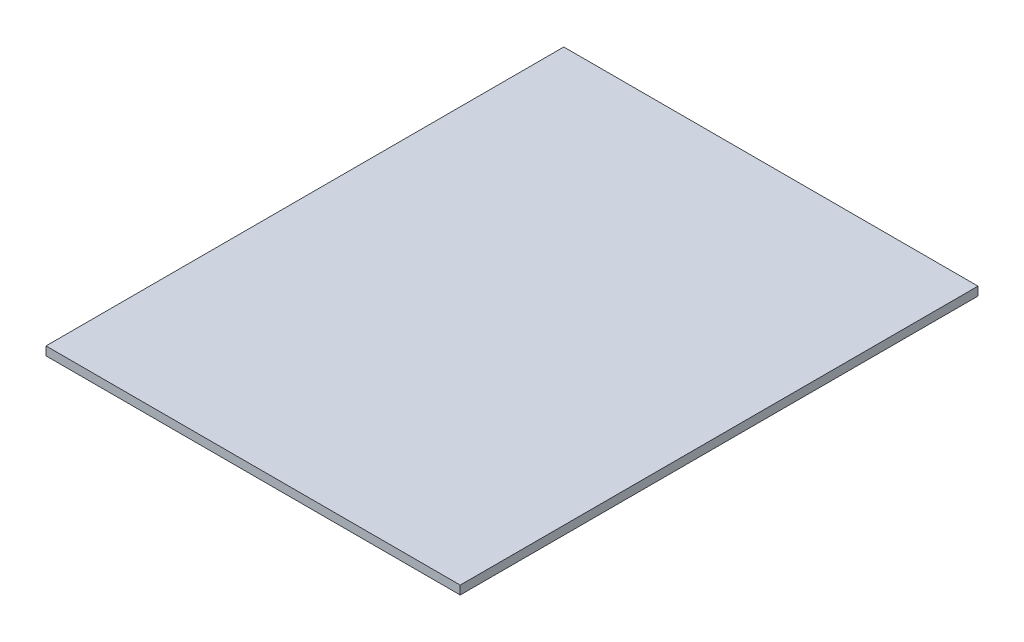
ISO-10303-21;
HEADER;
FILE_DESCRIPTION(('STEP AP214'),'2;1');
FILE_NAME('part.step','',(''),(''),'','','');
FILE_SCHEMA(('AUTOMOTIVE_DESIGN { 1 0 10303 214 1 1 1 1 }'));
ENDSEC;
DATA;
#1=APPLICATION_CONTEXT('core data for automotive mechanical design processes');
#2=APPLICATION_PROTOCOL_DEFINITION('international standard','automotive_design',2000,#1);
#3=PRODUCT_CONTEXT('',#1,'mechanical');
#4=PRODUCT('Part','Part','',(#3));
#5=PRODUCT_RELATED_PRODUCT_CATEGORY('part','',(#4));
#6=PRODUCT_DEFINITION_FORMATION('','',#4);
#7=PRODUCT_DEFINITION_CONTEXT('part definition',#1,'design');
#8=PRODUCT_DEFINITION('design','',#6,#7);
#9=PRODUCT_DEFINITION_SHAPE('','',#8);
#10=(LENGTH_UNIT() NAMED_UNIT(*) SI_UNIT(.MILLI.,.METRE.));
#11=(NAMED_UNIT(*) PLANE_ANGLE_UNIT() SI_UNIT($,.RADIAN.));
#12=(NAMED_UNIT(*) SI_UNIT($,.STERADIAN.) SOLID_ANGLE_UNIT());
#13=UNCERTAINTY_MEASURE_WITH_UNIT(LENGTH_MEASURE(1.E-05),#10,'distance_accuracy_value','');
#14=(GEOMETRIC_REPRESENTATION_CONTEXT(3) GLOBAL_UNCERTAINTY_ASSIGNED_CONTEXT((#13)) GLOBAL_UNIT_ASSIGNED_CONTEXT((#10,
#11,#12)) REPRESENTATION_CONTEXT('',''));
#15=CARTESIAN_POINT('',(0.,0.,0.));
#16=DIRECTION('',(0.,0.,1.));
#17=DIRECTION('',(1.,0.,0.));
#18=AXIS2_PLACEMENT_3D('',#15,#16,#17);
#19=CARTESIAN_POINT('',(154.8,6.35,150.));
#20=DIRECTION('',(-1.,0.,0.));
#21=DIRECTION('',(0.,0.,1.));
#22=AXIS2_PLACEMENT_3D('',#19,#20,#21);
#23=PLANE('',#22);
#24=DIRECTION('',(0.,0.,-1.));
#25=VECTOR('',#24,1.);
#26=CARTESIAN_POINT('',(154.8,0.,150.));
#27=LINE('',#26,#25);
#28=CARTESIAN_POINT('',(154.8,0.,150.));
#29=VERTEX_POINT('',#28);
#30=CARTESIAN_POINT('',(154.8,0.,-231.));
#31=VERTEX_POINT('',#30);
#32=EDGE_CURVE('E99',#29,#31,#27,.T.);
#33=ORIENTED_EDGE('',*,*,#32,.T.);
#34=DIRECTION('',(0.,-1.,0.));
#35=VECTOR('',#34,1.);
#36=CARTESIAN_POINT('',(154.8,6.35,-231.));
#37=LINE('',#36,#35);
#38=CARTESIAN_POINT('',(154.8,6.35,-231.));
#39=VERTEX_POINT('',#38);
#40=EDGE_CURVE('E11',#39,#31,#37,.T.);
#41=ORIENTED_EDGE('',*,*,#40,.F.);
#42=DIRECTION('',(0.,0.,-1.));
#43=VECTOR('',#42,1.);
#44=CARTESIAN_POINT('',(154.8,6.35,150.));
#45=LINE('',#44,#43);
#46=CARTESIAN_POINT('',(154.8,6.35,150.));
#47=VERTEX_POINT('',#46);
#48=EDGE_CURVE('E87',#47,#39,#45,.T.);
#49=ORIENTED_EDGE('',*,*,#48,.F.);
#50=DIRECTION('',(0.,-1.,0.));
#51=VECTOR('',#50,1.);
#52=CARTESIAN_POINT('',(154.8,6.35,150.));
#53=LINE('',#52,#51);
#54=EDGE_CURVE('E95',#47,#29,#53,.T.);
#55=ORIENTED_EDGE('',*,*,#54,.T.);
#56=EDGE_LOOP('',(#33,#41,#49,#55));
#57=FACE_BOUND('',#56,.T.);
#58=ADVANCED_FACE('F36',(#57),#23,.F.);
#59=CARTESIAN_POINT('',(-150.,6.35,-231.));
#60=DIRECTION('',(0.,0.,1.));
#61=DIRECTION('',(1.,0.,0.));
#62=AXIS2_PLACEMENT_3D('',#59,#60,#61);
#63=PLANE('',#62);
#64=DIRECTION('',(-1.,0.,0.));
#65=VECTOR('',#64,1.);
#66=CARTESIAN_POINT('',(-150.,0.,-231.));
#67=LINE('',#66,#65);
#68=CARTESIAN_POINT('',(-150.,0.,-231.));
#69=VERTEX_POINT('',#68);
#70=EDGE_CURVE('E91',#31,#69,#67,.T.);
#71=ORIENTED_EDGE('',*,*,#70,.T.);
#72=DIRECTION('',(0.,-1.,0.));
#73=VECTOR('',#72,1.);
#74=CARTESIAN_POINT('',(-150.,6.35,-231.));
#75=LINE('',#74,#73);
#76=CARTESIAN_POINT('',(-150.,6.35,-231.));
#77=VERTEX_POINT('',#76);
#78=EDGE_CURVE('E44',#77,#69,#75,.T.);
#79=ORIENTED_EDGE('',*,*,#78,.F.);
#80=DIRECTION('',(-1.,0.,0.));
#81=VECTOR('',#80,1.);
#82=CARTESIAN_POINT('',(-150.,6.35,-231.));
#83=LINE('',#82,#81);
#84=EDGE_CURVE('E82',#39,#77,#83,.T.);
#85=ORIENTED_EDGE('',*,*,#84,.F.);
#86=ORIENTED_EDGE('',*,*,#40,.T.);
#87=EDGE_LOOP('',(#71,#79,#85,#86));
#88=FACE_BOUND('',#87,.T.);
#89=ADVANCED_FACE('F90',(#88),#63,.F.);
#90=CARTESIAN_POINT('',(-150.,6.35,150.));
#91=DIRECTION('',(1.,0.,0.));
#92=DIRECTION('',(0.,0.,-1.));
#93=AXIS2_PLACEMENT_3D('',#90,#91,#92);
#94=PLANE('',#93);
#95=DIRECTION('',(0.,0.,1.));
#96=VECTOR('',#95,1.);
#97=CARTESIAN_POINT('',(-150.,0.,150.));
#98=LINE('',#97,#96);
#99=CARTESIAN_POINT('',(-150.,0.,150.));
#100=VERTEX_POINT('',#99);
#101=EDGE_CURVE('E69',#69,#100,#98,.T.);
#102=ORIENTED_EDGE('',*,*,#101,.T.);
#103=DIRECTION('',(0.,-1.,0.));
#104=VECTOR('',#103,1.);
#105=CARTESIAN_POINT('',(-150.,6.35,150.));
#106=LINE('',#105,#104);
#107=CARTESIAN_POINT('',(-150.,6.35,150.));
#108=VERTEX_POINT('',#107);
#109=EDGE_CURVE('E92',#108,#100,#106,.T.);
#110=ORIENTED_EDGE('',*,*,#109,.F.);
#111=DIRECTION('',(0.,0.,1.));
#112=VECTOR('',#111,1.);
#113=CARTESIAN_POINT('',(-150.,6.35,150.));
#114=LINE('',#113,#112);
#115=EDGE_CURVE('E85',#77,#108,#114,.T.);
#116=ORIENTED_EDGE('',*,*,#115,.F.);
#117=ORIENTED_EDGE('',*,*,#78,.T.);
#118=EDGE_LOOP('',(#102,#110,#116,#117));
#119=FACE_BOUND('',#118,.T.);
#120=ADVANCED_FACE('F93',(#119),#94,.F.);
#121=CARTESIAN_POINT('',(-150.,6.35,150.));
#122=DIRECTION('',(0.,0.,-1.));
#123=DIRECTION('',(-1.,0.,0.));
#124=AXIS2_PLACEMENT_3D('',#121,#122,#123);
#125=PLANE('',#124);
#126=DIRECTION('',(1.,0.,0.));
#127=VECTOR('',#126,1.);
#128=CARTESIAN_POINT('',(-150.,0.,150.));
#129=LINE('',#128,#127);
#130=EDGE_CURVE('E75',#100,#29,#129,.T.);
#131=ORIENTED_EDGE('',*,*,#130,.T.);
#132=ORIENTED_EDGE('',*,*,#54,.F.);
#133=DIRECTION('',(1.,0.,0.));
#134=VECTOR('',#133,1.);
#135=CARTESIAN_POINT('',(-150.,6.35,150.));
#136=LINE('',#135,#134);
#137=EDGE_CURVE('E52',#108,#47,#136,.T.);
#138=ORIENTED_EDGE('',*,*,#137,.F.);
#139=ORIENTED_EDGE('',*,*,#109,.T.);
#140=EDGE_LOOP('',(#131,#132,#138,#139));
#141=FACE_BOUND('',#140,.T.);
#142=ADVANCED_FACE('F106',(#141),#125,.F.);
#143=CARTESIAN_POINT('',(0.,6.35,0.));
#144=DIRECTION('',(0.,-1.,0.));
#145=DIRECTION('',(0.,0.,-1.));
#146=AXIS2_PLACEMENT_3D('',#143,#144,#145);
#147=PLANE('',#146);
#148=ORIENTED_EDGE('',*,*,#48,.T.);
#149=ORIENTED_EDGE('',*,*,#84,.T.);
#150=ORIENTED_EDGE('',*,*,#115,.T.);
#151=ORIENTED_EDGE('',*,*,#137,.T.);
#152=EDGE_LOOP('',(#148,#149,#150,#151));
#153=FACE_BOUND('',#152,.T.);
#154=ADVANCED_FACE('F83',(#153),#147,.F.);
#155=CARTESIAN_POINT('',(0.,0.,0.));
#156=DIRECTION('',(0.,-1.,0.));
#157=DIRECTION('',(0.,0.,-1.));
#158=AXIS2_PLACEMENT_3D('',#155,#156,#157);
#159=PLANE('',#158);
#160=ORIENTED_EDGE('',*,*,#32,.F.);
#161=ORIENTED_EDGE('',*,*,#130,.F.);
#162=ORIENTED_EDGE('',*,*,#101,.F.);
#163=ORIENTED_EDGE('',*,*,#70,.F.);
#164=EDGE_LOOP('',(#160,#161,#162,#163));
#165=FACE_BOUND('',#164,.T.);
#166=ADVANCED_FACE('F109',(#165),#159,.T.);
#167=CLOSED_SHELL('',(#58,#89,#120,#142,#154,#166));
#168=MANIFOLD_SOLID_BREP('B2',#167);
#169=ADVANCED_BREP_SHAPE_REPRESENTATION('',(#18,#168),#14);
#170=SHAPE_DEFINITION_REPRESENTATION(#9,#169);
ENDSEC;
END-ISO-10303-21;
